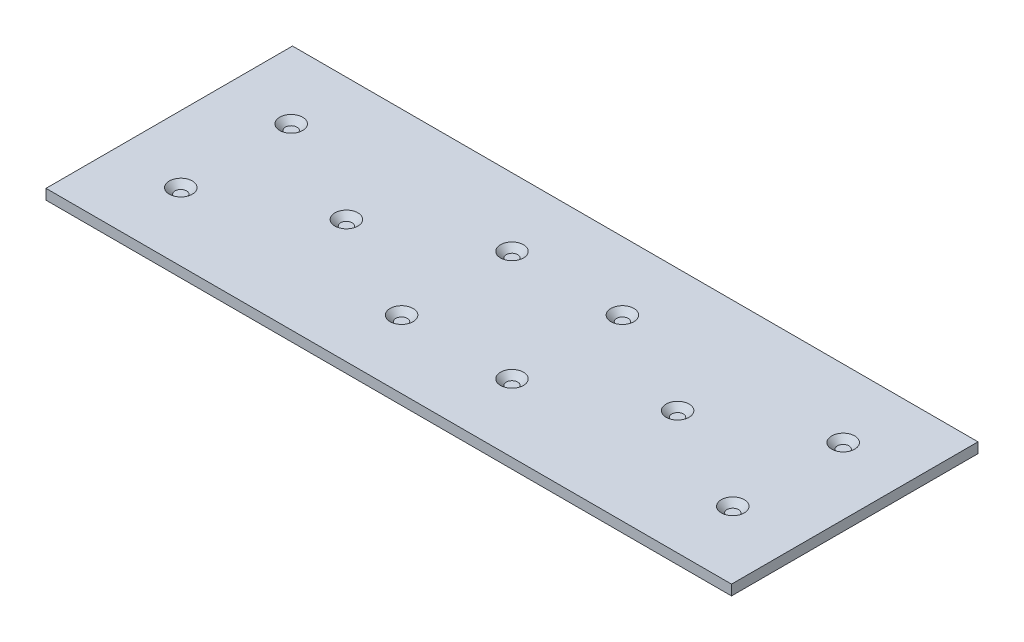
ISO-10303-21;
HEADER;
FILE_DESCRIPTION(('STEP AP214'),'2;1');
FILE_NAME('part.step','',(''),(''),'','','');
FILE_SCHEMA(('AUTOMOTIVE_DESIGN { 1 0 10303 214 1 1 1 1 }'));
ENDSEC;
DATA;
#1=APPLICATION_CONTEXT('core data for automotive mechanical design processes');
#2=APPLICATION_PROTOCOL_DEFINITION('international standard','automotive_design',2000,#1);
#3=PRODUCT_CONTEXT('',#1,'mechanical');
#4=PRODUCT('Part','Part','',(#3));
#5=PRODUCT_RELATED_PRODUCT_CATEGORY('part','',(#4));
#6=PRODUCT_DEFINITION_FORMATION('','',#4);
#7=PRODUCT_DEFINITION_CONTEXT('part definition',#1,'design');
#8=PRODUCT_DEFINITION('design','',#6,#7);
#9=PRODUCT_DEFINITION_SHAPE('','',#8);
#10=(LENGTH_UNIT() NAMED_UNIT(*) SI_UNIT(.MILLI.,.METRE.));
#11=(NAMED_UNIT(*) PLANE_ANGLE_UNIT() SI_UNIT($,.RADIAN.));
#12=(NAMED_UNIT(*) SI_UNIT($,.STERADIAN.) SOLID_ANGLE_UNIT());
#13=UNCERTAINTY_MEASURE_WITH_UNIT(LENGTH_MEASURE(1.E-05),#10,'distance_accuracy_value','');
#14=(GEOMETRIC_REPRESENTATION_CONTEXT(3) GLOBAL_UNCERTAINTY_ASSIGNED_CONTEXT((#13)) GLOBAL_UNIT_ASSIGNED_CONTEXT((#10,
#11,#12)) REPRESENTATION_CONTEXT('',''));
#15=CARTESIAN_POINT('',(0.,0.,0.));
#16=DIRECTION('',(0.,0.,1.));
#17=DIRECTION('',(1.,0.,0.));
#18=AXIS2_PLACEMENT_3D('',#15,#16,#17);
#19=CARTESIAN_POINT('',(0.,4.,0.));
#20=DIRECTION('',(1.,0.,0.));
#21=DIRECTION('',(0.,0.,-1.));
#22=AXIS2_PLACEMENT_3D('',#19,#20,#21);
#23=PLANE('',#22);
#24=DIRECTION('',(0.,0.,1.));
#25=VECTOR('',#24,1.);
#26=CARTESIAN_POINT('',(0.,0.,0.));
#27=LINE('',#26,#25);
#28=CARTESIAN_POINT('',(0.,0.,-96.));
#29=VERTEX_POINT('',#28);
#30=CARTESIAN_POINT('',(0.,0.,0.));
#31=VERTEX_POINT('',#30);
#32=EDGE_CURVE('E101',#29,#31,#27,.T.);
#33=ORIENTED_EDGE('',*,*,#32,.T.);
#34=DIRECTION('',(0.,-1.,0.));
#35=VECTOR('',#34,1.);
#36=CARTESIAN_POINT('',(0.,4.,0.));
#37=LINE('',#36,#35);
#38=CARTESIAN_POINT('',(0.,4.,0.));
#39=VERTEX_POINT('',#38);
#40=EDGE_CURVE('E11',#39,#31,#37,.T.);
#41=ORIENTED_EDGE('',*,*,#40,.F.);
#42=DIRECTION('',(0.,0.,1.));
#43=VECTOR('',#42,1.);
#44=CARTESIAN_POINT('',(0.,4.,0.));
#45=LINE('',#44,#43);
#46=CARTESIAN_POINT('',(0.,4.,-96.));
#47=VERTEX_POINT('',#46);
#48=EDGE_CURVE('E89',#47,#39,#45,.T.);
#49=ORIENTED_EDGE('',*,*,#48,.F.);
#50=DIRECTION('',(0.,-1.,0.));
#51=VECTOR('',#50,1.);
#52=CARTESIAN_POINT('',(0.,4.,-96.));
#53=LINE('',#52,#51);
#54=EDGE_CURVE('E97',#47,#29,#53,.T.);
#55=ORIENTED_EDGE('',*,*,#54,.T.);
#56=EDGE_LOOP('',(#33,#41,#49,#55));
#57=FACE_BOUND('',#56,.T.);
#58=ADVANCED_FACE('F38',(#57),#23,.F.);
#59=CARTESIAN_POINT('',(0.,4.,0.));
#60=DIRECTION('',(0.,0.,-1.));
#61=DIRECTION('',(-1.,0.,0.));
#62=AXIS2_PLACEMENT_3D('',#59,#60,#61);
#63=PLANE('',#62);
#64=DIRECTION('',(1.,0.,0.));
#65=VECTOR('',#64,1.);
#66=CARTESIAN_POINT('',(0.,0.,0.));
#67=LINE('',#66,#65);
#68=CARTESIAN_POINT('',(267.,0.,0.));
#69=VERTEX_POINT('',#68);
#70=EDGE_CURVE('E93',#31,#69,#67,.T.);
#71=ORIENTED_EDGE('',*,*,#70,.T.);
#72=DIRECTION('',(0.,-1.,0.));
#73=VECTOR('',#72,1.);
#74=CARTESIAN_POINT('',(267.,4.,0.));
#75=LINE('',#74,#73);
#76=CARTESIAN_POINT('',(267.,4.,0.));
#77=VERTEX_POINT('',#76);
#78=EDGE_CURVE('E46',#77,#69,#75,.T.);
#79=ORIENTED_EDGE('',*,*,#78,.F.);
#80=DIRECTION('',(1.,0.,0.));
#81=VECTOR('',#80,1.);
#82=CARTESIAN_POINT('',(0.,4.,0.));
#83=LINE('',#82,#81);
#84=EDGE_CURVE('E84',#39,#77,#83,.T.);
#85=ORIENTED_EDGE('',*,*,#84,.F.);
#86=ORIENTED_EDGE('',*,*,#40,.T.);
#87=EDGE_LOOP('',(#71,#79,#85,#86));
#88=FACE_BOUND('',#87,.T.);
#89=ADVANCED_FACE('F92',(#88),#63,.F.);
#90=CARTESIAN_POINT('',(267.,4.,0.));
#91=DIRECTION('',(-1.,0.,0.));
#92=DIRECTION('',(0.,0.,1.));
#93=AXIS2_PLACEMENT_3D('',#90,#91,#92);
#94=PLANE('',#93);
#95=DIRECTION('',(0.,0.,-1.));
#96=VECTOR('',#95,1.);
#97=CARTESIAN_POINT('',(267.,0.,0.));
#98=LINE('',#97,#96);
#99=CARTESIAN_POINT('',(267.,0.,-96.));
#100=VERTEX_POINT('',#99);
#101=EDGE_CURVE('E71',#69,#100,#98,.T.);
#102=ORIENTED_EDGE('',*,*,#101,.T.);
#103=DIRECTION('',(0.,-1.,0.));
#104=VECTOR('',#103,1.);
#105=CARTESIAN_POINT('',(267.,4.,-96.));
#106=LINE('',#105,#104);
#107=CARTESIAN_POINT('',(267.,4.,-96.));
#108=VERTEX_POINT('',#107);
#109=EDGE_CURVE('E94',#108,#100,#106,.T.);
#110=ORIENTED_EDGE('',*,*,#109,.F.);
#111=DIRECTION('',(0.,0.,-1.));
#112=VECTOR('',#111,1.);
#113=CARTESIAN_POINT('',(267.,4.,0.));
#114=LINE('',#113,#112);
#115=EDGE_CURVE('E87',#77,#108,#114,.T.);
#116=ORIENTED_EDGE('',*,*,#115,.F.);
#117=ORIENTED_EDGE('',*,*,#78,.T.);
#118=EDGE_LOOP('',(#102,#110,#116,#117));
#119=FACE_BOUND('',#118,.T.);
#120=ADVANCED_FACE('F95',(#119),#94,.F.);
#121=CARTESIAN_POINT('',(0.,4.,-96.));
#122=DIRECTION('',(0.,0.,1.));
#123=DIRECTION('',(1.,0.,0.));
#124=AXIS2_PLACEMENT_3D('',#121,#122,#123);
#125=PLANE('',#124);
#126=DIRECTION('',(-1.,0.,0.));
#127=VECTOR('',#126,1.);
#128=CARTESIAN_POINT('',(0.,0.,-96.));
#129=LINE('',#128,#127);
#130=EDGE_CURVE('E77',#100,#29,#129,.T.);
#131=ORIENTED_EDGE('',*,*,#130,.T.);
#132=ORIENTED_EDGE('',*,*,#54,.F.);
#133=DIRECTION('',(-1.,0.,0.));
#134=VECTOR('',#133,1.);
#135=CARTESIAN_POINT('',(0.,4.,-96.));
#136=LINE('',#135,#134);
#137=EDGE_CURVE('E54',#108,#47,#136,.T.);
#138=ORIENTED_EDGE('',*,*,#137,.F.);
#139=ORIENTED_EDGE('',*,*,#109,.T.);
#140=EDGE_LOOP('',(#131,#132,#138,#139));
#141=FACE_BOUND('',#140,.T.);
#142=ADVANCED_FACE('F109',(#141),#125,.F.);
#143=CARTESIAN_POINT('',(0.,4.,0.));
#144=DIRECTION('',(0.,-1.,0.));
#145=DIRECTION('',(0.,0.,-1.));
#146=AXIS2_PLACEMENT_3D('',#143,#144,#145);
#147=PLANE('',#146);
#148=CARTESIAN_POINT('',(26.,4.,-69.5));
#149=DIRECTION('',(0.,1.,0.));
#150=DIRECTION('',(0.,0.,1.));
#151=AXIS2_PLACEMENT_3D('',#148,#149,#150);
#152=CIRCLE('',#151,4.48);
#153=CARTESIAN_POINT('',(26.,4.,-65.02));
#154=VERTEX_POINT('',#153);
#155=EDGE_CURVE('E168',#154,#154,#152,.T.);
#156=ORIENTED_EDGE('',*,*,#155,.F.);
#157=EDGE_LOOP('',(#156));
#158=FACE_BOUND('',#157,.T.);
#159=CARTESIAN_POINT('',(26.,4.,-26.5));
#160=DIRECTION('',(0.,1.,0.));
#161=DIRECTION('',(0.,0.,1.));
#162=AXIS2_PLACEMENT_3D('',#159,#160,#161);
#163=CIRCLE('',#162,4.48);
#164=CARTESIAN_POINT('',(26.,4.,-22.02));
#165=VERTEX_POINT('',#164);
#166=EDGE_CURVE('E162',#165,#165,#163,.T.);
#167=ORIENTED_EDGE('',*,*,#166,.F.);
#168=EDGE_LOOP('',(#167));
#169=FACE_BOUND('',#168,.T.);
#170=CARTESIAN_POINT('',(69.,4.,-48.));
#171=DIRECTION('',(0.,1.,0.));
#172=DIRECTION('',(0.,0.,1.));
#173=AXIS2_PLACEMENT_3D('',#170,#171,#172);
#174=CIRCLE('',#173,4.48);
#175=CARTESIAN_POINT('',(69.,4.,-43.52));
#176=VERTEX_POINT('',#175);
#177=EDGE_CURVE('E156',#176,#176,#174,.T.);
#178=ORIENTED_EDGE('',*,*,#177,.F.);
#179=EDGE_LOOP('',(#178));
#180=FACE_BOUND('',#179,.T.);
#181=CARTESIAN_POINT('',(112.,4.,-69.5));
#182=DIRECTION('',(0.,1.,0.));
#183=DIRECTION('',(0.,0.,1.));
#184=AXIS2_PLACEMENT_3D('',#181,#182,#183);
#185=CIRCLE('',#184,4.48);
#186=CARTESIAN_POINT('',(112.,4.,-65.02));
#187=VERTEX_POINT('',#186);
#188=EDGE_CURVE('E150',#187,#187,#185,.T.);
#189=ORIENTED_EDGE('',*,*,#188,.F.);
#190=EDGE_LOOP('',(#189));
#191=FACE_BOUND('',#190,.T.);
#192=CARTESIAN_POINT('',(112.,4.,-26.5));
#193=DIRECTION('',(0.,1.,0.));
#194=DIRECTION('',(0.,0.,1.));
#195=AXIS2_PLACEMENT_3D('',#192,#193,#194);
#196=CIRCLE('',#195,4.48);
#197=CARTESIAN_POINT('',(112.,4.,-22.02));
#198=VERTEX_POINT('',#197);
#199=EDGE_CURVE('E144',#198,#198,#196,.T.);
#200=ORIENTED_EDGE('',*,*,#199,.F.);
#201=EDGE_LOOP('',(#200));
#202=FACE_BOUND('',#201,.T.);
#203=CARTESIAN_POINT('',(155.,4.,-26.5));
#204=DIRECTION('',(0.,1.,0.));
#205=DIRECTION('',(0.,0.,1.));
#206=AXIS2_PLACEMENT_3D('',#203,#204,#205);
#207=CIRCLE('',#206,4.48000000000001);
#208=CARTESIAN_POINT('',(155.,4.,-22.02));
#209=VERTEX_POINT('',#208);
#210=EDGE_CURVE('E138',#209,#209,#207,.T.);
#211=ORIENTED_EDGE('',*,*,#210,.F.);
#212=EDGE_LOOP('',(#211));
#213=FACE_BOUND('',#212,.T.);
#214=CARTESIAN_POINT('',(155.,4.,-69.5));
#215=DIRECTION('',(0.,1.,0.));
#216=DIRECTION('',(0.,0.,1.));
#217=AXIS2_PLACEMENT_3D('',#214,#215,#216);
#218=CIRCLE('',#217,4.48000000000001);
#219=CARTESIAN_POINT('',(155.,4.,-65.02));
#220=VERTEX_POINT('',#219);
#221=EDGE_CURVE('E132',#220,#220,#218,.T.);
#222=ORIENTED_EDGE('',*,*,#221,.F.);
#223=EDGE_LOOP('',(#222));
#224=FACE_BOUND('',#223,.T.);
#225=CARTESIAN_POINT('',(241.,4.,-69.5));
#226=DIRECTION('',(0.,1.,0.));
#227=DIRECTION('',(0.,0.,1.));
#228=AXIS2_PLACEMENT_3D('',#225,#226,#227);
#229=CIRCLE('',#228,4.48000000000001);
#230=CARTESIAN_POINT('',(241.,4.,-65.02));
#231=VERTEX_POINT('',#230);
#232=EDGE_CURVE('E126',#231,#231,#229,.T.);
#233=ORIENTED_EDGE('',*,*,#232,.F.);
#234=EDGE_LOOP('',(#233));
#235=FACE_BOUND('',#234,.T.);
#236=CARTESIAN_POINT('',(198.,4.,-48.));
#237=DIRECTION('',(0.,1.,0.));
#238=DIRECTION('',(0.,0.,1.));
#239=AXIS2_PLACEMENT_3D('',#236,#237,#238);
#240=CIRCLE('',#239,4.48000000000001);
#241=CARTESIAN_POINT('',(198.,4.,-43.52));
#242=VERTEX_POINT('',#241);
#243=EDGE_CURVE('E120',#242,#242,#240,.T.);
#244=ORIENTED_EDGE('',*,*,#243,.F.);
#245=EDGE_LOOP('',(#244));
#246=FACE_BOUND('',#245,.T.);
#247=CARTESIAN_POINT('',(241.,4.,-26.5));
#248=DIRECTION('',(0.,1.,0.));
#249=DIRECTION('',(0.,0.,1.));
#250=AXIS2_PLACEMENT_3D('',#247,#248,#249);
#251=CIRCLE('',#250,4.48000000000001);
#252=CARTESIAN_POINT('',(241.,4.,-22.02));
#253=VERTEX_POINT('',#252);
#254=EDGE_CURVE('E104',#253,#253,#251,.T.);
#255=ORIENTED_EDGE('',*,*,#254,.F.);
#256=EDGE_LOOP('',(#255));
#257=FACE_BOUND('',#256,.T.);
#258=ORIENTED_EDGE('',*,*,#48,.T.);
#259=ORIENTED_EDGE('',*,*,#84,.T.);
#260=ORIENTED_EDGE('',*,*,#115,.T.);
#261=ORIENTED_EDGE('',*,*,#137,.T.);
#262=EDGE_LOOP('',(#258,#259,#260,#261));
#263=FACE_BOUND('',#262,.T.);
#264=ADVANCED_FACE('F85',(#158,#169,#180,#191,#202,#213,#224,#235,#246,#257,#263),#147,.F.);
#265=CARTESIAN_POINT('',(0.,0.,0.));
#266=DIRECTION('',(0.,-1.,0.));
#267=DIRECTION('',(0.,0.,-1.));
#268=AXIS2_PLACEMENT_3D('',#265,#266,#267);
#269=PLANE('',#268);
#270=ORIENTED_EDGE('',*,*,#32,.F.);
#271=ORIENTED_EDGE('',*,*,#130,.F.);
#272=ORIENTED_EDGE('',*,*,#101,.F.);
#273=ORIENTED_EDGE('',*,*,#70,.F.);
#274=EDGE_LOOP('',(#270,#271,#272,#273));
#275=FACE_BOUND('',#274,.T.);
#276=ADVANCED_FACE('F112',(#275),#269,.T.);
#277=CARTESIAN_POINT('',(241.,4.,-26.5));
#278=DIRECTION('',(0.,1.,0.));
#279=DIRECTION('',(0.,0.,1.));
#280=AXIS2_PLACEMENT_3D('',#277,#278,#279);
#281=CONICAL_SURFACE('',#280,4.48000000000001,0.78539816339745);
#282=CARTESIAN_POINT('',(241.,1.77,-26.5));
#283=DIRECTION('',(0.,1.,0.));
#284=DIRECTION('',(0.,0.,1.));
#285=AXIS2_PLACEMENT_3D('',#282,#283,#284);
#286=CIRCLE('',#285,2.25);
#287=CARTESIAN_POINT('',(241.,1.77,-24.25));
#288=VERTEX_POINT('',#287);
#289=EDGE_CURVE('E117',#288,#288,#286,.T.);
#290=ORIENTED_EDGE('',*,*,#289,.F.);
#291=EDGE_LOOP('',(#290));
#292=FACE_BOUND('',#291,.T.);
#293=ORIENTED_EDGE('',*,*,#254,.T.);
#294=EDGE_LOOP('',(#293));
#295=FACE_BOUND('',#294,.T.);
#296=ADVANCED_FACE('F205',(#292,#295),#281,.F.);
#297=CARTESIAN_POINT('',(243.25,1.77,-26.5));
#298=DIRECTION('',(0.,-1.,0.));
#299=DIRECTION('',(0.,0.,-1.));
#300=AXIS2_PLACEMENT_3D('',#297,#298,#299);
#301=PLANE('',#300);
#302=ORIENTED_EDGE('',*,*,#289,.T.);
#303=EDGE_LOOP('',(#302));
#304=FACE_BOUND('',#303,.T.);
#305=ADVANCED_FACE('F207',(#304),#301,.F.);
#306=CARTESIAN_POINT('',(198.,4.,-48.));
#307=DIRECTION('',(0.,1.,0.));
#308=DIRECTION('',(0.,0.,1.));
#309=AXIS2_PLACEMENT_3D('',#306,#307,#308);
#310=CONICAL_SURFACE('',#309,4.48000000000001,0.78539816339745);
#311=CARTESIAN_POINT('',(198.,1.77,-48.));
#312=DIRECTION('',(0.,1.,0.));
#313=DIRECTION('',(0.,0.,1.));
#314=AXIS2_PLACEMENT_3D('',#311,#312,#313);
#315=CIRCLE('',#314,2.25);
#316=CARTESIAN_POINT('',(198.,1.77,-45.75));
#317=VERTEX_POINT('',#316);
#318=EDGE_CURVE('E123',#317,#317,#315,.T.);
#319=ORIENTED_EDGE('',*,*,#318,.F.);
#320=EDGE_LOOP('',(#319));
#321=FACE_BOUND('',#320,.T.);
#322=ORIENTED_EDGE('',*,*,#243,.T.);
#323=EDGE_LOOP('',(#322));
#324=FACE_BOUND('',#323,.T.);
#325=ADVANCED_FACE('F214',(#321,#324),#310,.F.);
#326=CARTESIAN_POINT('',(200.25,1.77,-48.));
#327=DIRECTION('',(0.,-1.,0.));
#328=DIRECTION('',(0.,0.,-1.));
#329=AXIS2_PLACEMENT_3D('',#326,#327,#328);
#330=PLANE('',#329);
#331=ORIENTED_EDGE('',*,*,#318,.T.);
#332=EDGE_LOOP('',(#331));
#333=FACE_BOUND('',#332,.T.);
#334=ADVANCED_FACE('F264',(#333),#330,.F.);
#335=CARTESIAN_POINT('',(241.,4.,-69.5));
#336=DIRECTION('',(0.,1.,0.));
#337=DIRECTION('',(0.,0.,1.));
#338=AXIS2_PLACEMENT_3D('',#335,#336,#337);
#339=CONICAL_SURFACE('',#338,4.48000000000001,0.78539816339745);
#340=CARTESIAN_POINT('',(241.,1.77,-69.5));
#341=DIRECTION('',(0.,1.,0.));
#342=DIRECTION('',(0.,0.,1.));
#343=AXIS2_PLACEMENT_3D('',#340,#341,#342);
#344=CIRCLE('',#343,2.25);
#345=CARTESIAN_POINT('',(241.,1.77,-67.25));
#346=VERTEX_POINT('',#345);
#347=EDGE_CURVE('E129',#346,#346,#344,.T.);
#348=ORIENTED_EDGE('',*,*,#347,.F.);
#349=EDGE_LOOP('',(#348));
#350=FACE_BOUND('',#349,.T.);
#351=ORIENTED_EDGE('',*,*,#232,.T.);
#352=EDGE_LOOP('',(#351));
#353=FACE_BOUND('',#352,.T.);
#354=ADVANCED_FACE('F274',(#350,#353),#339,.F.);
#355=CARTESIAN_POINT('',(243.25,1.77,-69.5));
#356=DIRECTION('',(0.,-1.,0.));
#357=DIRECTION('',(0.,0.,-1.));
#358=AXIS2_PLACEMENT_3D('',#355,#356,#357);
#359=PLANE('',#358);
#360=ORIENTED_EDGE('',*,*,#347,.T.);
#361=EDGE_LOOP('',(#360));
#362=FACE_BOUND('',#361,.T.);
#363=ADVANCED_FACE('F284',(#362),#359,.F.);
#364=CARTESIAN_POINT('',(155.,4.,-69.5));
#365=DIRECTION('',(0.,1.,0.));
#366=DIRECTION('',(0.,0.,1.));
#367=AXIS2_PLACEMENT_3D('',#364,#365,#366);
#368=CONICAL_SURFACE('',#367,4.48000000000001,0.78539816339745);
#369=CARTESIAN_POINT('',(155.,1.77,-69.5));
#370=DIRECTION('',(0.,1.,0.));
#371=DIRECTION('',(0.,0.,1.));
#372=AXIS2_PLACEMENT_3D('',#369,#370,#371);
#373=CIRCLE('',#372,2.25);
#374=CARTESIAN_POINT('',(155.,1.77,-67.25));
#375=VERTEX_POINT('',#374);
#376=EDGE_CURVE('E135',#375,#375,#373,.T.);
#377=ORIENTED_EDGE('',*,*,#376,.F.);
#378=EDGE_LOOP('',(#377));
#379=FACE_BOUND('',#378,.T.);
#380=ORIENTED_EDGE('',*,*,#221,.T.);
#381=EDGE_LOOP('',(#380));
#382=FACE_BOUND('',#381,.T.);
#383=ADVANCED_FACE('F294',(#379,#382),#368,.F.);
#384=CARTESIAN_POINT('',(157.25,1.77,-69.5));
#385=DIRECTION('',(0.,-1.,0.));
#386=DIRECTION('',(0.,0.,-1.));
#387=AXIS2_PLACEMENT_3D('',#384,#385,#386);
#388=PLANE('',#387);
#389=ORIENTED_EDGE('',*,*,#376,.T.);
#390=EDGE_LOOP('',(#389));
#391=FACE_BOUND('',#390,.T.);
#392=ADVANCED_FACE('F304',(#391),#388,.F.);
#393=CARTESIAN_POINT('',(155.,4.,-26.5));
#394=DIRECTION('',(0.,1.,0.));
#395=DIRECTION('',(0.,0.,1.));
#396=AXIS2_PLACEMENT_3D('',#393,#394,#395);
#397=CONICAL_SURFACE('',#396,4.48000000000001,0.78539816339745);
#398=CARTESIAN_POINT('',(155.,1.77,-26.5));
#399=DIRECTION('',(0.,1.,0.));
#400=DIRECTION('',(0.,0.,1.));
#401=AXIS2_PLACEMENT_3D('',#398,#399,#400);
#402=CIRCLE('',#401,2.25);
#403=CARTESIAN_POINT('',(155.,1.77,-24.25));
#404=VERTEX_POINT('',#403);
#405=EDGE_CURVE('E141',#404,#404,#402,.T.);
#406=ORIENTED_EDGE('',*,*,#405,.F.);
#407=EDGE_LOOP('',(#406));
#408=FACE_BOUND('',#407,.T.);
#409=ORIENTED_EDGE('',*,*,#210,.T.);
#410=EDGE_LOOP('',(#409));
#411=FACE_BOUND('',#410,.T.);
#412=ADVANCED_FACE('F314',(#408,#411),#397,.F.);
#413=CARTESIAN_POINT('',(157.25,1.77,-26.5));
#414=DIRECTION('',(0.,-1.,0.));
#415=DIRECTION('',(0.,0.,-1.));
#416=AXIS2_PLACEMENT_3D('',#413,#414,#415);
#417=PLANE('',#416);
#418=ORIENTED_EDGE('',*,*,#405,.T.);
#419=EDGE_LOOP('',(#418));
#420=FACE_BOUND('',#419,.T.);
#421=ADVANCED_FACE('F324',(#420),#417,.F.);
#422=CARTESIAN_POINT('',(112.,4.,-26.5));
#423=DIRECTION('',(0.,1.,0.));
#424=DIRECTION('',(0.,0.,1.));
#425=AXIS2_PLACEMENT_3D('',#422,#423,#424);
#426=CONICAL_SURFACE('',#425,4.48,0.785398163397447);
#427=CARTESIAN_POINT('',(112.,1.77,-26.5));
#428=DIRECTION('',(0.,1.,0.));
#429=DIRECTION('',(0.,0.,1.));
#430=AXIS2_PLACEMENT_3D('',#427,#428,#429);
#431=CIRCLE('',#430,2.25);
#432=CARTESIAN_POINT('',(112.,1.77,-24.25));
#433=VERTEX_POINT('',#432);
#434=EDGE_CURVE('E147',#433,#433,#431,.T.);
#435=ORIENTED_EDGE('',*,*,#434,.F.);
#436=EDGE_LOOP('',(#435));
#437=FACE_BOUND('',#436,.T.);
#438=ORIENTED_EDGE('',*,*,#199,.T.);
#439=EDGE_LOOP('',(#438));
#440=FACE_BOUND('',#439,.T.);
#441=ADVANCED_FACE('F334',(#437,#440),#426,.F.);
#442=CARTESIAN_POINT('',(114.25,1.77,-26.5));
#443=DIRECTION('',(0.,-1.,0.));
#444=DIRECTION('',(0.,0.,-1.));
#445=AXIS2_PLACEMENT_3D('',#442,#443,#444);
#446=PLANE('',#445);
#447=ORIENTED_EDGE('',*,*,#434,.T.);
#448=EDGE_LOOP('',(#447));
#449=FACE_BOUND('',#448,.T.);
#450=ADVANCED_FACE('F344',(#449),#446,.F.);
#451=CARTESIAN_POINT('',(112.,4.,-69.5));
#452=DIRECTION('',(0.,1.,0.));
#453=DIRECTION('',(0.,0.,1.));
#454=AXIS2_PLACEMENT_3D('',#451,#452,#453);
#455=CONICAL_SURFACE('',#454,4.48,0.785398163397447);
#456=CARTESIAN_POINT('',(112.,1.77,-69.5));
#457=DIRECTION('',(0.,1.,0.));
#458=DIRECTION('',(0.,0.,1.));
#459=AXIS2_PLACEMENT_3D('',#456,#457,#458);
#460=CIRCLE('',#459,2.25);
#461=CARTESIAN_POINT('',(112.,1.77,-67.25));
#462=VERTEX_POINT('',#461);
#463=EDGE_CURVE('E153',#462,#462,#460,.T.);
#464=ORIENTED_EDGE('',*,*,#463,.F.);
#465=EDGE_LOOP('',(#464));
#466=FACE_BOUND('',#465,.T.);
#467=ORIENTED_EDGE('',*,*,#188,.T.);
#468=EDGE_LOOP('',(#467));
#469=FACE_BOUND('',#468,.T.);
#470=ADVANCED_FACE('F354',(#466,#469),#455,.F.);
#471=CARTESIAN_POINT('',(114.25,1.77,-69.5));
#472=DIRECTION('',(0.,-1.,0.));
#473=DIRECTION('',(0.,0.,-1.));
#474=AXIS2_PLACEMENT_3D('',#471,#472,#473);
#475=PLANE('',#474);
#476=ORIENTED_EDGE('',*,*,#463,.T.);
#477=EDGE_LOOP('',(#476));
#478=FACE_BOUND('',#477,.T.);
#479=ADVANCED_FACE('F364',(#478),#475,.F.);
#480=CARTESIAN_POINT('',(69.,4.,-48.));
#481=DIRECTION('',(0.,1.,0.));
#482=DIRECTION('',(0.,0.,1.));
#483=AXIS2_PLACEMENT_3D('',#480,#481,#482);
#484=CONICAL_SURFACE('',#483,4.48,0.785398163397447);
#485=CARTESIAN_POINT('',(69.,1.77,-48.));
#486=DIRECTION('',(0.,1.,0.));
#487=DIRECTION('',(0.,0.,1.));
#488=AXIS2_PLACEMENT_3D('',#485,#486,#487);
#489=CIRCLE('',#488,2.25);
#490=CARTESIAN_POINT('',(69.,1.77,-45.75));
#491=VERTEX_POINT('',#490);
#492=EDGE_CURVE('E159',#491,#491,#489,.T.);
#493=ORIENTED_EDGE('',*,*,#492,.F.);
#494=EDGE_LOOP('',(#493));
#495=FACE_BOUND('',#494,.T.);
#496=ORIENTED_EDGE('',*,*,#177,.T.);
#497=EDGE_LOOP('',(#496));
#498=FACE_BOUND('',#497,.T.);
#499=ADVANCED_FACE('F374',(#495,#498),#484,.F.);
#500=CARTESIAN_POINT('',(71.25,1.77,-48.));
#501=DIRECTION('',(0.,-1.,0.));
#502=DIRECTION('',(0.,0.,-1.));
#503=AXIS2_PLACEMENT_3D('',#500,#501,#502);
#504=PLANE('',#503);
#505=ORIENTED_EDGE('',*,*,#492,.T.);
#506=EDGE_LOOP('',(#505));
#507=FACE_BOUND('',#506,.T.);
#508=ADVANCED_FACE('F384',(#507),#504,.F.);
#509=CARTESIAN_POINT('',(26.,4.,-26.5));
#510=DIRECTION('',(0.,1.,0.));
#511=DIRECTION('',(0.,0.,1.));
#512=AXIS2_PLACEMENT_3D('',#509,#510,#511);
#513=CONICAL_SURFACE('',#512,4.48,0.785398163397449);
#514=CARTESIAN_POINT('',(26.,1.77,-26.5));
#515=DIRECTION('',(0.,1.,0.));
#516=DIRECTION('',(0.,0.,1.));
#517=AXIS2_PLACEMENT_3D('',#514,#515,#516);
#518=CIRCLE('',#517,2.25);
#519=CARTESIAN_POINT('',(26.,1.77,-24.25));
#520=VERTEX_POINT('',#519);
#521=EDGE_CURVE('E165',#520,#520,#518,.T.);
#522=ORIENTED_EDGE('',*,*,#521,.F.);
#523=EDGE_LOOP('',(#522));
#524=FACE_BOUND('',#523,.T.);
#525=ORIENTED_EDGE('',*,*,#166,.T.);
#526=EDGE_LOOP('',(#525));
#527=FACE_BOUND('',#526,.T.);
#528=ADVANCED_FACE('F394',(#524,#527),#513,.F.);
#529=CARTESIAN_POINT('',(28.25,1.77,-26.5));
#530=DIRECTION('',(0.,-1.,0.));
#531=DIRECTION('',(0.,0.,-1.));
#532=AXIS2_PLACEMENT_3D('',#529,#530,#531);
#533=PLANE('',#532);
#534=ORIENTED_EDGE('',*,*,#521,.T.);
#535=EDGE_LOOP('',(#534));
#536=FACE_BOUND('',#535,.T.);
#537=ADVANCED_FACE('F180',(#536),#533,.F.);
#538=CARTESIAN_POINT('',(26.,4.,-69.5));
#539=DIRECTION('',(0.,1.,0.));
#540=DIRECTION('',(0.,0.,1.));
#541=AXIS2_PLACEMENT_3D('',#538,#539,#540);
#542=CONICAL_SURFACE('',#541,4.48,0.785398163397449);
#543=CARTESIAN_POINT('',(26.,1.77,-69.5));
#544=DIRECTION('',(0.,1.,0.));
#545=DIRECTION('',(0.,0.,1.));
#546=AXIS2_PLACEMENT_3D('',#543,#544,#545);
#547=CIRCLE('',#546,2.25);
#548=CARTESIAN_POINT('',(26.,1.77,-67.25));
#549=VERTEX_POINT('',#548);
#550=EDGE_CURVE('E171',#549,#549,#547,.T.);
#551=ORIENTED_EDGE('',*,*,#550,.F.);
#552=EDGE_LOOP('',(#551));
#553=FACE_BOUND('',#552,.T.);
#554=ORIENTED_EDGE('',*,*,#155,.T.);
#555=EDGE_LOOP('',(#554));
#556=FACE_BOUND('',#555,.T.);
#557=ADVANCED_FACE('F177',(#553,#556),#542,.F.);
#558=CARTESIAN_POINT('',(28.25,1.77,-69.5));
#559=DIRECTION('',(0.,-1.,0.));
#560=DIRECTION('',(0.,0.,-1.));
#561=AXIS2_PLACEMENT_3D('',#558,#559,#560);
#562=PLANE('',#561);
#563=ORIENTED_EDGE('',*,*,#550,.T.);
#564=EDGE_LOOP('',(#563));
#565=FACE_BOUND('',#564,.T.);
#566=ADVANCED_FACE('F175',(#565),#562,.F.);
#567=CLOSED_SHELL('',(#58,#89,#120,#142,#264,#276,#296,#305,#325,#334,#354,#363,#383,#392,#412,
#421,#441,#450,#470,#479,#499,#508,#528,#537,#557,#566));
#568=MANIFOLD_SOLID_BREP('B2',#567);
#569=ADVANCED_BREP_SHAPE_REPRESENTATION('',(#18,#568),#14);
#570=SHAPE_DEFINITION_REPRESENTATION(#9,#569);
ENDSEC;
END-ISO-10303-21;
